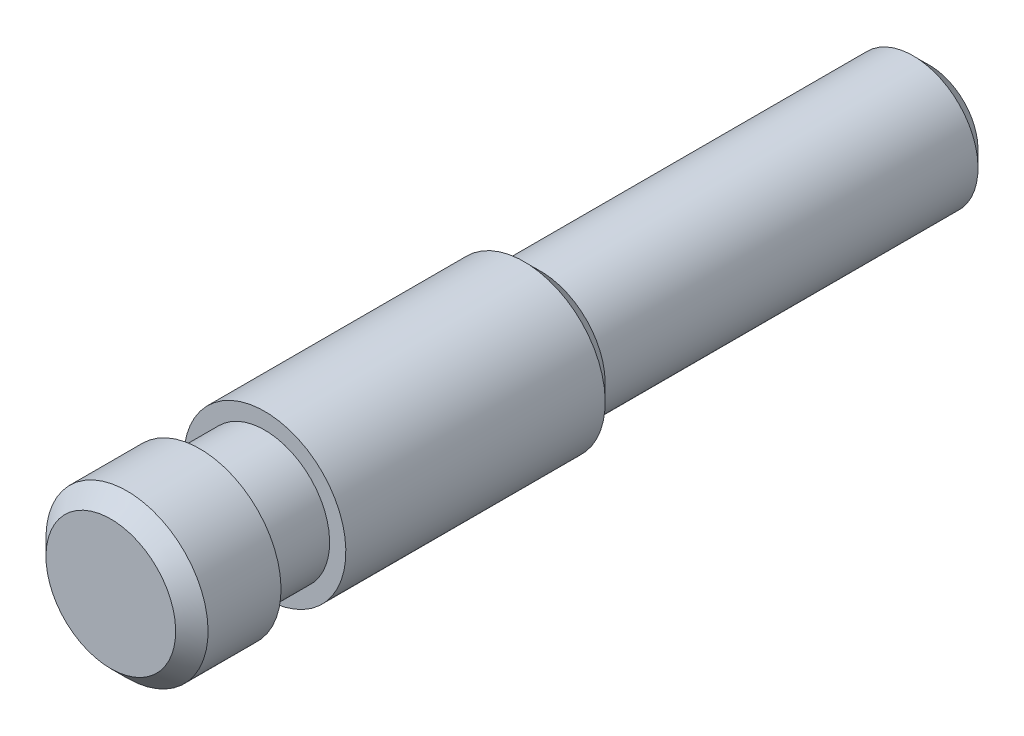
ISO-10303-21;
HEADER;
FILE_DESCRIPTION(('STEP AP214'),'2;1');
FILE_NAME('part.step','',(''),(''),'','','');
FILE_SCHEMA(('AUTOMOTIVE_DESIGN { 1 0 10303 214 1 1 1 1 }'));
ENDSEC;
DATA;
#1=APPLICATION_CONTEXT('core data for automotive mechanical design processes');
#2=APPLICATION_PROTOCOL_DEFINITION('international standard','automotive_design',2000,#1);
#3=PRODUCT_CONTEXT('',#1,'mechanical');
#4=PRODUCT('Part','Part','',(#3));
#5=PRODUCT_RELATED_PRODUCT_CATEGORY('part','',(#4));
#6=PRODUCT_DEFINITION_FORMATION('','',#4);
#7=PRODUCT_DEFINITION_CONTEXT('part definition',#1,'design');
#8=PRODUCT_DEFINITION('design','',#6,#7);
#9=PRODUCT_DEFINITION_SHAPE('','',#8);
#10=(LENGTH_UNIT() NAMED_UNIT(*) SI_UNIT(.MILLI.,.METRE.));
#11=(NAMED_UNIT(*) PLANE_ANGLE_UNIT() SI_UNIT($,.RADIAN.));
#12=(NAMED_UNIT(*) SI_UNIT($,.STERADIAN.) SOLID_ANGLE_UNIT());
#13=UNCERTAINTY_MEASURE_WITH_UNIT(LENGTH_MEASURE(1.E-05),#10,'distance_accuracy_value','');
#14=(GEOMETRIC_REPRESENTATION_CONTEXT(3) GLOBAL_UNCERTAINTY_ASSIGNED_CONTEXT((#13)) GLOBAL_UNIT_ASSIGNED_CONTEXT((#10,
#11,#12)) REPRESENTATION_CONTEXT('',''));
#15=CARTESIAN_POINT('',(0.,0.,0.));
#16=DIRECTION('',(0.,0.,1.));
#17=DIRECTION('',(1.,0.,0.));
#18=AXIS2_PLACEMENT_3D('',#15,#16,#17);
#19=CARTESIAN_POINT('',(0.,0.,37.5));
#20=DIRECTION('',(0.,0.,-1.));
#21=DIRECTION('',(0.,1.,0.));
#22=AXIS2_PLACEMENT_3D('',#19,#20,#21);
#23=CONICAL_SURFACE('',#22,5.,0.785398163397448);
#24=CARTESIAN_POINT('',(0.,0.,38.5));
#25=DIRECTION('',(0.,0.,1.));
#26=DIRECTION('',(0.,-1.,0.));
#27=AXIS2_PLACEMENT_3D('',#24,#25,#26);
#28=CIRCLE('',#27,4.);
#29=CARTESIAN_POINT('',(0.,-4.,38.5));
#30=VERTEX_POINT('',#29);
#31=EDGE_CURVE('E80',#30,#30,#28,.T.);
#32=ORIENTED_EDGE('',*,*,#31,.F.);
#33=EDGE_LOOP('',(#32));
#34=FACE_BOUND('',#33,.T.);
#35=CARTESIAN_POINT('',(0.,0.,37.5));
#36=DIRECTION('',(0.,0.,1.));
#37=DIRECTION('',(0.,-1.,0.));
#38=AXIS2_PLACEMENT_3D('',#35,#36,#37);
#39=CIRCLE('',#38,5.);
#40=CARTESIAN_POINT('',(0.,-5.,37.5));
#41=VERTEX_POINT('',#40);
#42=EDGE_CURVE('E10',#41,#41,#39,.T.);
#43=ORIENTED_EDGE('',*,*,#42,.T.);
#44=EDGE_LOOP('',(#43));
#45=FACE_BOUND('',#44,.T.);
#46=ADVANCED_FACE('F37',(#34,#45),#23,.T.);
#47=CARTESIAN_POINT('',(0.,0.,38.5));
#48=DIRECTION('',(0.,0.,1.));
#49=DIRECTION('',(0.,-1.,0.));
#50=AXIS2_PLACEMENT_3D('',#47,#48,#49);
#51=CYLINDRICAL_SURFACE('',#50,5.);
#52=ORIENTED_EDGE('',*,*,#42,.F.);
#53=EDGE_LOOP('',(#52));
#54=FACE_BOUND('',#53,.T.);
#55=CARTESIAN_POINT('',(0.,0.,33.));
#56=DIRECTION('',(0.,0.,1.));
#57=DIRECTION('',(0.,-1.,0.));
#58=AXIS2_PLACEMENT_3D('',#55,#56,#57);
#59=CIRCLE('',#58,5.);
#60=CARTESIAN_POINT('',(0.,-5.,33.));
#61=VERTEX_POINT('',#60);
#62=EDGE_CURVE('E44',#61,#61,#59,.T.);
#63=ORIENTED_EDGE('',*,*,#62,.T.);
#64=EDGE_LOOP('',(#63));
#65=FACE_BOUND('',#64,.T.);
#66=ADVANCED_FACE('F88',(#54,#65),#51,.T.);
#67=CARTESIAN_POINT('',(0.,4.,33.));
#68=DIRECTION('',(0.,0.,1.));
#69=DIRECTION('',(0.,-1.,0.));
#70=AXIS2_PLACEMENT_3D('',#67,#68,#69);
#71=PLANE('',#70);
#72=ORIENTED_EDGE('',*,*,#62,.F.);
#73=EDGE_LOOP('',(#72));
#74=FACE_BOUND('',#73,.T.);
#75=CARTESIAN_POINT('',(0.,0.,33.));
#76=DIRECTION('',(0.,0.,1.));
#77=DIRECTION('',(0.,-1.,0.));
#78=AXIS2_PLACEMENT_3D('',#75,#76,#77);
#79=CIRCLE('',#78,4.);
#80=CARTESIAN_POINT('',(0.,-4.,33.));
#81=VERTEX_POINT('',#80);
#82=EDGE_CURVE('E49',#81,#81,#79,.T.);
#83=ORIENTED_EDGE('',*,*,#82,.T.);
#84=EDGE_LOOP('',(#83));
#85=FACE_BOUND('',#84,.T.);
#86=ADVANCED_FACE('F92',(#74,#85),#71,.F.);
#87=CARTESIAN_POINT('',(0.,0.,38.5));
#88=DIRECTION('',(0.,0.,1.));
#89=DIRECTION('',(0.,-1.,0.));
#90=AXIS2_PLACEMENT_3D('',#87,#88,#89);
#91=CYLINDRICAL_SURFACE('',#90,4.);
#92=ORIENTED_EDGE('',*,*,#82,.F.);
#93=EDGE_LOOP('',(#92));
#94=FACE_BOUND('',#93,.T.);
#95=CARTESIAN_POINT('',(0.,0.,29.));
#96=DIRECTION('',(0.,0.,1.));
#97=DIRECTION('',(0.,-1.,0.));
#98=AXIS2_PLACEMENT_3D('',#95,#96,#97);
#99=CIRCLE('',#98,4.);
#100=CARTESIAN_POINT('',(0.,-4.,29.));
#101=VERTEX_POINT('',#100);
#102=EDGE_CURVE('E54',#101,#101,#99,.T.);
#103=ORIENTED_EDGE('',*,*,#102,.T.);
#104=EDGE_LOOP('',(#103));
#105=FACE_BOUND('',#104,.T.);
#106=ADVANCED_FACE('F97',(#94,#105),#91,.T.);
#107=CARTESIAN_POINT('',(0.,5.,29.));
#108=DIRECTION('',(0.,0.,-1.));
#109=DIRECTION('',(0.,1.,0.));
#110=AXIS2_PLACEMENT_3D('',#107,#108,#109);
#111=PLANE('',#110);
#112=ORIENTED_EDGE('',*,*,#102,.F.);
#113=EDGE_LOOP('',(#112));
#114=FACE_BOUND('',#113,.T.);
#115=CARTESIAN_POINT('',(0.,0.,29.));
#116=DIRECTION('',(0.,0.,1.));
#117=DIRECTION('',(0.,-1.,0.));
#118=AXIS2_PLACEMENT_3D('',#115,#116,#117);
#119=CIRCLE('',#118,5.);
#120=CARTESIAN_POINT('',(0.,-5.,29.));
#121=VERTEX_POINT('',#120);
#122=EDGE_CURVE('E60',#121,#121,#119,.T.);
#123=ORIENTED_EDGE('',*,*,#122,.T.);
#124=EDGE_LOOP('',(#123));
#125=FACE_BOUND('',#124,.T.);
#126=ADVANCED_FACE('F103',(#114,#125),#111,.F.);
#127=CARTESIAN_POINT('',(0.,0.,38.5));
#128=DIRECTION('',(0.,0.,1.));
#129=DIRECTION('',(0.,-1.,0.));
#130=AXIS2_PLACEMENT_3D('',#127,#128,#129);
#131=CYLINDRICAL_SURFACE('',#130,5.);
#132=ORIENTED_EDGE('',*,*,#122,.F.);
#133=EDGE_LOOP('',(#132));
#134=FACE_BOUND('',#133,.T.);
#135=CARTESIAN_POINT('',(0.,0.,13.));
#136=DIRECTION('',(0.,0.,1.));
#137=DIRECTION('',(0.,-1.,0.));
#138=AXIS2_PLACEMENT_3D('',#135,#136,#137);
#139=CIRCLE('',#138,5.);
#140=CARTESIAN_POINT('',(0.,-5.,13.));
#141=VERTEX_POINT('',#140);
#142=EDGE_CURVE('E64',#141,#141,#139,.T.);
#143=ORIENTED_EDGE('',*,*,#142,.T.);
#144=EDGE_LOOP('',(#143));
#145=FACE_BOUND('',#144,.T.);
#146=ADVANCED_FACE('F107',(#134,#145),#131,.T.);
#147=CARTESIAN_POINT('',(0.,0.,12.));
#148=DIRECTION('',(0.,0.,1.));
#149=DIRECTION('',(0.,-1.,0.));
#150=AXIS2_PLACEMENT_3D('',#147,#148,#149);
#151=CONICAL_SURFACE('',#150,4.,0.785398163397438);
#152=ORIENTED_EDGE('',*,*,#142,.F.);
#153=EDGE_LOOP('',(#152));
#154=FACE_BOUND('',#153,.T.);
#155=CARTESIAN_POINT('',(0.,0.,12.));
#156=DIRECTION('',(0.,0.,1.));
#157=DIRECTION('',(0.,-1.,0.));
#158=AXIS2_PLACEMENT_3D('',#155,#156,#157);
#159=CIRCLE('',#158,4.);
#160=CARTESIAN_POINT('',(0.,-4.,12.));
#161=VERTEX_POINT('',#160);
#162=EDGE_CURVE('E68',#161,#161,#159,.T.);
#163=ORIENTED_EDGE('',*,*,#162,.T.);
#164=EDGE_LOOP('',(#163));
#165=FACE_BOUND('',#164,.T.);
#166=ADVANCED_FACE('F111',(#154,#165),#151,.T.);
#167=CARTESIAN_POINT('',(0.,0.,38.5));
#168=DIRECTION('',(0.,0.,1.));
#169=DIRECTION('',(0.,-1.,0.));
#170=AXIS2_PLACEMENT_3D('',#167,#168,#169);
#171=CYLINDRICAL_SURFACE('',#170,4.);
#172=ORIENTED_EDGE('',*,*,#162,.F.);
#173=EDGE_LOOP('',(#172));
#174=FACE_BOUND('',#173,.T.);
#175=CARTESIAN_POINT('',(0.,0.,-11.));
#176=DIRECTION('',(0.,0.,1.));
#177=DIRECTION('',(0.,-1.,0.));
#178=AXIS2_PLACEMENT_3D('',#175,#176,#177);
#179=CIRCLE('',#178,4.00000000000001);
#180=CARTESIAN_POINT('',(0.,-4.00000000000001,-11.));
#181=VERTEX_POINT('',#180);
#182=EDGE_CURVE('E72',#181,#181,#179,.T.);
#183=ORIENTED_EDGE('',*,*,#182,.T.);
#184=EDGE_LOOP('',(#183));
#185=FACE_BOUND('',#184,.T.);
#186=ADVANCED_FACE('F115',(#174,#185),#171,.T.);
#187=CARTESIAN_POINT('',(0.,0.,-12.));
#188=DIRECTION('',(0.,0.,1.));
#189=DIRECTION('',(0.,-1.,0.));
#190=AXIS2_PLACEMENT_3D('',#187,#188,#189);
#191=CONICAL_SURFACE('',#190,3.00000000000001,0.785398163397451);
#192=ORIENTED_EDGE('',*,*,#182,.F.);
#193=EDGE_LOOP('',(#192));
#194=FACE_BOUND('',#193,.T.);
#195=CARTESIAN_POINT('',(0.,0.,-12.));
#196=DIRECTION('',(0.,0.,1.));
#197=DIRECTION('',(0.,-1.,0.));
#198=AXIS2_PLACEMENT_3D('',#195,#196,#197);
#199=CIRCLE('',#198,3.00000000000001);
#200=CARTESIAN_POINT('',(0.,-3.00000000000001,-12.));
#201=VERTEX_POINT('',#200);
#202=EDGE_CURVE('E76',#201,#201,#199,.T.);
#203=ORIENTED_EDGE('',*,*,#202,.T.);
#204=EDGE_LOOP('',(#203));
#205=FACE_BOUND('',#204,.T.);
#206=ADVANCED_FACE('F119',(#194,#205),#191,.T.);
#207=CARTESIAN_POINT('',(0.,0.,-12.));
#208=DIRECTION('',(0.,0.,1.));
#209=DIRECTION('',(0.,-1.,0.));
#210=AXIS2_PLACEMENT_3D('',#207,#208,#209);
#211=PLANE('',#210);
#212=ORIENTED_EDGE('',*,*,#202,.F.);
#213=EDGE_LOOP('',(#212));
#214=FACE_BOUND('',#213,.T.);
#215=ADVANCED_FACE('F123',(#214),#211,.F.);
#216=CARTESIAN_POINT('',(0.,4.,38.5));
#217=DIRECTION('',(0.,0.,-1.));
#218=DIRECTION('',(0.,1.,0.));
#219=AXIS2_PLACEMENT_3D('',#216,#217,#218);
#220=PLANE('',#219);
#221=ORIENTED_EDGE('',*,*,#31,.T.);
#222=EDGE_LOOP('',(#221));
#223=FACE_BOUND('',#222,.T.);
#224=ADVANCED_FACE('F85',(#223),#220,.F.);
#225=CLOSED_SHELL('',(#46,#66,#86,#106,#126,#146,#166,#186,#206,#215,#224));
#226=MANIFOLD_SOLID_BREP('B2',#225);
#227=ADVANCED_BREP_SHAPE_REPRESENTATION('',(#18,#226),#14);
#228=SHAPE_DEFINITION_REPRESENTATION(#9,#227);
ENDSEC;
END-ISO-10303-21;
